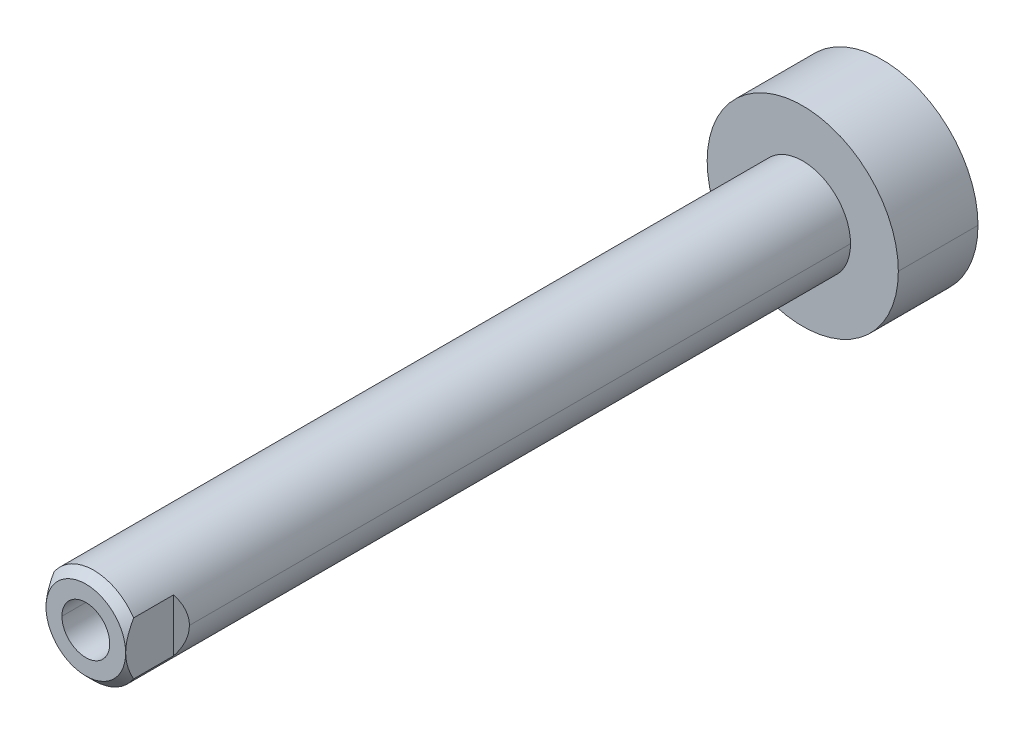
ISO-10303-21;
HEADER;
FILE_DESCRIPTION(('STEP AP214'),'2;1');
FILE_NAME('part.step','',(''),(''),'','','');
FILE_SCHEMA(('AUTOMOTIVE_DESIGN { 1 0 10303 214 1 1 1 1 }'));
ENDSEC;
DATA;
#1=APPLICATION_CONTEXT('core data for automotive mechanical design processes');
#2=APPLICATION_PROTOCOL_DEFINITION('international standard','automotive_design',2000,#1);
#3=PRODUCT_CONTEXT('',#1,'mechanical');
#4=PRODUCT('Part','Part','',(#3));
#5=PRODUCT_RELATED_PRODUCT_CATEGORY('part','',(#4));
#6=PRODUCT_DEFINITION_FORMATION('','',#4);
#7=PRODUCT_DEFINITION_CONTEXT('part definition',#1,'design');
#8=PRODUCT_DEFINITION('design','',#6,#7);
#9=PRODUCT_DEFINITION_SHAPE('','',#8);
#10=(LENGTH_UNIT() NAMED_UNIT(*) SI_UNIT(.MILLI.,.METRE.));
#11=(NAMED_UNIT(*) PLANE_ANGLE_UNIT() SI_UNIT($,.RADIAN.));
#12=(NAMED_UNIT(*) SI_UNIT($,.STERADIAN.) SOLID_ANGLE_UNIT());
#13=UNCERTAINTY_MEASURE_WITH_UNIT(LENGTH_MEASURE(1.E-05),#10,'distance_accuracy_value','');
#14=(GEOMETRIC_REPRESENTATION_CONTEXT(3) GLOBAL_UNCERTAINTY_ASSIGNED_CONTEXT((#13)) GLOBAL_UNIT_ASSIGNED_CONTEXT((#10,
#11,#12)) REPRESENTATION_CONTEXT('',''));
#15=CARTESIAN_POINT('',(0.,0.,0.));
#16=DIRECTION('',(0.,0.,1.));
#17=DIRECTION('',(1.,0.,0.));
#18=AXIS2_PLACEMENT_3D('',#15,#16,#17);
#19=CARTESIAN_POINT('',(0.,0.,32.5));
#20=DIRECTION('',(0.,0.,1.));
#21=DIRECTION('',(1.,0.,0.));
#22=AXIS2_PLACEMENT_3D('',#19,#20,#21);
#23=CYLINDRICAL_SURFACE('',#22,1.5);
#24=CARTESIAN_POINT('',(0.,0.,26.5));
#25=DIRECTION('',(0.,0.,1.));
#26=DIRECTION('',(1.,0.,0.));
#27=AXIS2_PLACEMENT_3D('',#24,#25,#26);
#28=CIRCLE('',#27,1.5);
#29=CARTESIAN_POINT('',(-1.5,0.,26.5));
#30=VERTEX_POINT('',#29);
#31=CARTESIAN_POINT('',(1.5,0.,26.5));
#32=VERTEX_POINT('',#31);
#33=EDGE_CURVE('E41',#30,#32,#28,.T.);
#34=ORIENTED_EDGE('',*,*,#33,.F.);
#35=DIRECTION('',(0.,0.,1.));
#36=VECTOR('',#35,1.);
#37=CARTESIAN_POINT('',(-1.5,0.,32.5));
#38=LINE('',#37,#36);
#39=CARTESIAN_POINT('',(-1.5,0.,32.5));
#40=VERTEX_POINT('',#39);
#41=EDGE_CURVE('E11',#30,#40,#38,.T.);
#42=ORIENTED_EDGE('',*,*,#41,.T.);
#43=CARTESIAN_POINT('',(0.,0.,32.5));
#44=DIRECTION('',(0.,0.,1.));
#45=DIRECTION('',(1.,0.,0.));
#46=AXIS2_PLACEMENT_3D('',#43,#44,#45);
#47=CIRCLE('',#46,1.5);
#48=CARTESIAN_POINT('',(1.5,0.,32.5));
#49=VERTEX_POINT('',#48);
#50=EDGE_CURVE('E27',#40,#49,#47,.T.);
#51=ORIENTED_EDGE('',*,*,#50,.T.);
#52=DIRECTION('',(0.,0.,1.));
#53=VECTOR('',#52,1.);
#54=CARTESIAN_POINT('',(1.5,0.,32.5));
#55=LINE('',#54,#53);
#56=EDGE_CURVE('E295',#32,#49,#55,.T.);
#57=ORIENTED_EDGE('',*,*,#56,.F.);
#58=EDGE_LOOP('',(#34,#42,#51,#57));
#59=FACE_BOUND('',#58,.T.);
#60=ADVANCED_FACE('F16',(#59),#23,.F.);
#61=CARTESIAN_POINT('',(0.,0.,32.5));
#62=DIRECTION('',(0.,0.,1.));
#63=DIRECTION('',(1.,0.,0.));
#64=AXIS2_PLACEMENT_3D('',#61,#62,#63);
#65=CYLINDRICAL_SURFACE('',#64,1.25);
#66=CARTESIAN_POINT('',(0.,0.,25.));
#67=DIRECTION('',(0.,0.,1.));
#68=DIRECTION('',(1.,0.,0.));
#69=AXIS2_PLACEMENT_3D('',#66,#67,#68);
#70=CIRCLE('',#69,1.25);
#71=CARTESIAN_POINT('',(-1.25,0.,25.));
#72=VERTEX_POINT('',#71);
#73=CARTESIAN_POINT('',(1.25,0.,25.));
#74=VERTEX_POINT('',#73);
#75=EDGE_CURVE('E250',#72,#74,#70,.T.);
#76=ORIENTED_EDGE('',*,*,#75,.F.);
#77=DIRECTION('',(0.,0.,1.));
#78=VECTOR('',#77,1.);
#79=CARTESIAN_POINT('',(-1.25,0.,32.5));
#80=LINE('',#79,#78);
#81=CARTESIAN_POINT('',(-1.25,0.,26.5));
#82=VERTEX_POINT('',#81);
#83=EDGE_CURVE('E425',#72,#82,#80,.T.);
#84=ORIENTED_EDGE('',*,*,#83,.T.);
#85=CARTESIAN_POINT('',(0.,0.,26.5));
#86=DIRECTION('',(0.,0.,1.));
#87=DIRECTION('',(1.,0.,0.));
#88=AXIS2_PLACEMENT_3D('',#85,#86,#87);
#89=CIRCLE('',#88,1.25);
#90=CARTESIAN_POINT('',(1.25,0.,26.5));
#91=VERTEX_POINT('',#90);
#92=EDGE_CURVE('E270',#82,#91,#89,.T.);
#93=ORIENTED_EDGE('',*,*,#92,.T.);
#94=DIRECTION('',(0.,0.,1.));
#95=VECTOR('',#94,1.);
#96=CARTESIAN_POINT('',(1.25,0.,32.5));
#97=LINE('',#96,#95);
#98=EDGE_CURVE('E240',#74,#91,#97,.T.);
#99=ORIENTED_EDGE('',*,*,#98,.F.);
#100=EDGE_LOOP('',(#76,#84,#93,#99));
#101=FACE_BOUND('',#100,.T.);
#102=ADVANCED_FACE('F411',(#101),#65,.F.);
#103=CARTESIAN_POINT('',(0.,0.,25.));
#104=DIRECTION('',(0.,0.,1.));
#105=DIRECTION('',(1.,0.,0.));
#106=AXIS2_PLACEMENT_3D('',#103,#104,#105);
#107=CONICAL_SURFACE('',#106,1.25,1.02974425867665);
#108=DIRECTION('',(0.857167300702112,0.,0.515038074910055));
#109=VECTOR('',#108,1.);
#110=CARTESIAN_POINT('',(1.25,0.,25.));
#111=LINE('',#110,#109);
#112=CARTESIAN_POINT('',(0.,0.,24.2489242262155));
#113=VERTEX_POINT('',#112);
#114=EDGE_CURVE('E242',#113,#74,#111,.T.);
#115=ORIENTED_EDGE('',*,*,#114,.F.);
#116=DIRECTION('',(-0.857167300702112,0.,0.515038074910055));
#117=VECTOR('',#116,1.);
#118=CARTESIAN_POINT('',(-1.25,0.,25.));
#119=LINE('',#118,#117);
#120=EDGE_CURVE('E266',#113,#72,#119,.T.);
#121=ORIENTED_EDGE('',*,*,#120,.T.);
#122=ORIENTED_EDGE('',*,*,#75,.T.);
#123=EDGE_LOOP('',(#115,#121,#122));
#124=FACE_BOUND('',#123,.T.);
#125=ADVANCED_FACE('F366',(#124),#107,.F.);
#126=CARTESIAN_POINT('',(0.,0.,-17.5));
#127=DIRECTION('',(0.,0.,1.));
#128=DIRECTION('',(1.,0.,0.));
#129=AXIS2_PLACEMENT_3D('',#126,#127,#128);
#130=CYLINDRICAL_SURFACE('',#129,3.);
#131=CARTESIAN_POINT('',(0.,0.,-12.5));
#132=DIRECTION('',(0.,0.,1.));
#133=DIRECTION('',(1.,0.,0.));
#134=AXIS2_PLACEMENT_3D('',#131,#132,#133);
#135=CIRCLE('',#134,3.);
#136=CARTESIAN_POINT('',(3.,0.,-12.5));
#137=VERTEX_POINT('',#136);
#138=CARTESIAN_POINT('',(-3.,0.,-12.5));
#139=VERTEX_POINT('',#138);
#140=EDGE_CURVE('E222',#137,#139,#135,.T.);
#141=ORIENTED_EDGE('',*,*,#140,.T.);
#142=DIRECTION('',(0.,0.,1.));
#143=VECTOR('',#142,1.);
#144=CARTESIAN_POINT('',(-3.,0.,-17.5));
#145=LINE('',#144,#143);
#146=CARTESIAN_POINT('',(-3.,0.,29.));
#147=VERTEX_POINT('',#146);
#148=EDGE_CURVE('E213',#139,#147,#145,.T.);
#149=ORIENTED_EDGE('',*,*,#148,.T.);
#150=CARTESIAN_POINT('',(-3.,0.,29.));
#151=CARTESIAN_POINT('',(-3.,0.594215243544948,29.));
#152=CARTESIAN_POINT('',(-2.82846483459138,1.16313302555691,29.1715351654086));
#153=CARTESIAN_POINT('',(-2.5,1.65831239517771,29.5));
#154=(BOUNDED_CURVE() B_SPLINE_CURVE(3,(#150,#151,#152,#153),.UNSPECIFIED.,.F.,
.F.) B_SPLINE_CURVE_WITH_KNOTS((4,4),(3.1415926535898,3.72727819704694),
.UNSPECIFIED.) CURVE() GEOMETRIC_REPRESENTATION_ITEM() RATIONAL_B_SPLINE_CURVE((1.,
0.971618071837558,0.971618071837558,1.)) REPRESENTATION_ITEM(''));
#155=CARTESIAN_POINT('',(-2.5,1.65831239517771,29.5));
#156=VERTEX_POINT('',#155);
#157=EDGE_CURVE('E206',#147,#156,#154,.T.);
#158=ORIENTED_EDGE('',*,*,#157,.T.);
#159=DIRECTION('',(0.,0.,1.));
#160=VECTOR('',#159,1.);
#161=CARTESIAN_POINT('',(-2.5,1.65831239517771,29.5));
#162=LINE('',#161,#160);
#163=CARTESIAN_POINT('',(-2.5,1.65831239517771,32.));
#164=VERTEX_POINT('',#163);
#165=EDGE_CURVE('E155',#156,#164,#162,.T.);
#166=ORIENTED_EDGE('',*,*,#165,.T.);
#167=CARTESIAN_POINT('',(0.,0.,32.));
#168=DIRECTION('',(0.,0.,-1.));
#169=DIRECTION('',(-1.,0.,0.));
#170=AXIS2_PLACEMENT_3D('',#167,#168,#169);
#171=CIRCLE('',#170,3.);
#172=CARTESIAN_POINT('',(2.5,1.65831239517771,32.));
#173=VERTEX_POINT('',#172);
#174=EDGE_CURVE('E151',#164,#173,#171,.T.);
#175=ORIENTED_EDGE('',*,*,#174,.T.);
#176=DIRECTION('',(0.,0.,1.));
#177=VECTOR('',#176,1.);
#178=CARTESIAN_POINT('',(2.5,1.65831239517771,29.5));
#179=LINE('',#178,#177);
#180=CARTESIAN_POINT('',(2.5,1.65831239517771,29.5));
#181=VERTEX_POINT('',#180);
#182=EDGE_CURVE('E134',#181,#173,#179,.T.);
#183=ORIENTED_EDGE('',*,*,#182,.F.);
#184=CARTESIAN_POINT('',(2.5,1.65831239517771,29.5));
#185=CARTESIAN_POINT('',(2.82846483459137,1.16313302555691,29.1715351654086));
#186=CARTESIAN_POINT('',(3.,0.594215243544947,29.));
#187=CARTESIAN_POINT('',(3.,0.,29.));
#188=(BOUNDED_CURVE() B_SPLINE_CURVE(3,(#184,#185,#186,#187),.UNSPECIFIED.,.F.,
.F.) B_SPLINE_CURVE_WITH_KNOTS((4,4),(2.55590711013264,3.1415926535898),
.UNSPECIFIED.) CURVE() GEOMETRIC_REPRESENTATION_ITEM() RATIONAL_B_SPLINE_CURVE((1.,
0.971618071837559,0.971618071837559,1.)) REPRESENTATION_ITEM(''));
#189=CARTESIAN_POINT('',(3.,0.,29.));
#190=VERTEX_POINT('',#189);
#191=EDGE_CURVE('E160',#181,#190,#188,.T.);
#192=ORIENTED_EDGE('',*,*,#191,.T.);
#193=DIRECTION('',(0.,0.,1.));
#194=VECTOR('',#193,1.);
#195=CARTESIAN_POINT('',(3.,0.,-17.5));
#196=LINE('',#195,#194);
#197=EDGE_CURVE('E279',#137,#190,#196,.T.);
#198=ORIENTED_EDGE('',*,*,#197,.F.);
#199=EDGE_LOOP('',(#141,#149,#158,#166,#175,#183,#192,#198));
#200=FACE_BOUND('',#199,.T.);
#201=ADVANCED_FACE('F153',(#200),#130,.T.);
#202=CARTESIAN_POINT('',(0.,0.,-17.5));
#203=DIRECTION('',(0.,0.,1.));
#204=DIRECTION('',(1.,0.,0.));
#205=AXIS2_PLACEMENT_3D('',#202,#203,#204);
#206=CYLINDRICAL_SURFACE('',#205,6.);
#207=CARTESIAN_POINT('',(0.,0.,-17.5));
#208=DIRECTION('',(0.,0.,1.));
#209=DIRECTION('',(1.,0.,0.));
#210=AXIS2_PLACEMENT_3D('',#207,#208,#209);
#211=CIRCLE('',#210,6.);
#212=CARTESIAN_POINT('',(6.,0.,-17.5));
#213=VERTEX_POINT('',#212);
#214=CARTESIAN_POINT('',(-6.,0.,-17.5));
#215=VERTEX_POINT('',#214);
#216=EDGE_CURVE('E287',#213,#215,#211,.T.);
#217=ORIENTED_EDGE('',*,*,#216,.T.);
#218=DIRECTION('',(0.,0.,1.));
#219=VECTOR('',#218,1.);
#220=CARTESIAN_POINT('',(-6.,0.,-17.5));
#221=LINE('',#220,#219);
#222=CARTESIAN_POINT('',(-6.,0.,-12.5));
#223=VERTEX_POINT('',#222);
#224=EDGE_CURVE('E300',#215,#223,#221,.T.);
#225=ORIENTED_EDGE('',*,*,#224,.T.);
#226=CARTESIAN_POINT('',(0.,0.,-12.5));
#227=DIRECTION('',(0.,0.,1.));
#228=DIRECTION('',(1.,0.,0.));
#229=AXIS2_PLACEMENT_3D('',#226,#227,#228);
#230=CIRCLE('',#229,6.);
#231=CARTESIAN_POINT('',(6.,0.,-12.5));
#232=VERTEX_POINT('',#231);
#233=EDGE_CURVE('E233',#232,#223,#230,.T.);
#234=ORIENTED_EDGE('',*,*,#233,.F.);
#235=DIRECTION('',(0.,0.,1.));
#236=VECTOR('',#235,1.);
#237=CARTESIAN_POINT('',(6.,0.,-17.5));
#238=LINE('',#237,#236);
#239=EDGE_CURVE('E265',#213,#232,#238,.T.);
#240=ORIENTED_EDGE('',*,*,#239,.F.);
#241=EDGE_LOOP('',(#217,#225,#234,#240));
#242=FACE_BOUND('',#241,.T.);
#243=ADVANCED_FACE('F398',(#242),#206,.T.);
#244=CARTESIAN_POINT('',(0.,0.,-17.5));
#245=DIRECTION('',(0.,0.,1.));
#246=DIRECTION('',(1.,0.,0.));
#247=AXIS2_PLACEMENT_3D('',#244,#245,#246);
#248=PLANE('',#247);
#249=ORIENTED_EDGE('',*,*,#216,.F.);
#250=CARTESIAN_POINT('',(0.,0.,-17.5));
#251=DIRECTION('',(0.,0.,1.));
#252=DIRECTION('',(1.,0.,0.));
#253=AXIS2_PLACEMENT_3D('',#250,#251,#252);
#254=CIRCLE('',#253,6.);
#255=EDGE_CURVE('E301',#215,#213,#254,.T.);
#256=ORIENTED_EDGE('',*,*,#255,.F.);
#257=EDGE_LOOP('',(#249,#256));
#258=FACE_BOUND('',#257,.T.);
#259=ADVANCED_FACE('F402',(#258),#248,.F.);
#260=CARTESIAN_POINT('',(0.,0.,-17.5));
#261=DIRECTION('',(0.,0.,1.));
#262=DIRECTION('',(1.,0.,0.));
#263=AXIS2_PLACEMENT_3D('',#260,#261,#262);
#264=CYLINDRICAL_SURFACE('',#263,6.);
#265=ORIENTED_EDGE('',*,*,#224,.F.);
#266=ORIENTED_EDGE('',*,*,#255,.T.);
#267=ORIENTED_EDGE('',*,*,#239,.T.);
#268=CARTESIAN_POINT('',(0.,0.,-12.5));
#269=DIRECTION('',(0.,0.,1.));
#270=DIRECTION('',(1.,0.,0.));
#271=AXIS2_PLACEMENT_3D('',#268,#269,#270);
#272=CIRCLE('',#271,6.);
#273=EDGE_CURVE('E228',#223,#232,#272,.T.);
#274=ORIENTED_EDGE('',*,*,#273,.F.);
#275=EDGE_LOOP('',(#265,#266,#267,#274));
#276=FACE_BOUND('',#275,.T.);
#277=ADVANCED_FACE('F18',(#276),#264,.T.);
#278=CARTESIAN_POINT('',(0.,6.,-12.5));
#279=DIRECTION('',(0.,0.,-1.));
#280=DIRECTION('',(0.,-1.,0.));
#281=AXIS2_PLACEMENT_3D('',#278,#279,#280);
#282=PLANE('',#281);
#283=ORIENTED_EDGE('',*,*,#233,.T.);
#284=ORIENTED_EDGE('',*,*,#273,.T.);
#285=EDGE_LOOP('',(#283,#284));
#286=FACE_BOUND('',#285,.T.);
#287=ORIENTED_EDGE('',*,*,#140,.F.);
#288=CARTESIAN_POINT('',(0.,0.,-12.5));
#289=DIRECTION('',(0.,0.,1.));
#290=DIRECTION('',(1.,0.,0.));
#291=AXIS2_PLACEMENT_3D('',#288,#289,#290);
#292=CIRCLE('',#291,3.);
#293=EDGE_CURVE('E234',#139,#137,#292,.T.);
#294=ORIENTED_EDGE('',*,*,#293,.F.);
#295=EDGE_LOOP('',(#287,#294));
#296=FACE_BOUND('',#295,.T.);
#297=ADVANCED_FACE('F476',(#286,#296),#282,.F.);
#298=CARTESIAN_POINT('',(0.,0.,-17.5));
#299=DIRECTION('',(0.,0.,1.));
#300=DIRECTION('',(1.,0.,0.));
#301=AXIS2_PLACEMENT_3D('',#298,#299,#300);
#302=CYLINDRICAL_SURFACE('',#301,3.);
#303=ORIENTED_EDGE('',*,*,#148,.F.);
#304=ORIENTED_EDGE('',*,*,#293,.T.);
#305=ORIENTED_EDGE('',*,*,#197,.T.);
#306=CARTESIAN_POINT('',(3.,0.,29.));
#307=CARTESIAN_POINT('',(3.,-0.594215243544945,29.));
#308=CARTESIAN_POINT('',(2.82846483459137,-1.16313302555691,29.1715351654086));
#309=CARTESIAN_POINT('',(2.5,-1.65831239517771,29.5));
#310=(BOUNDED_CURVE() B_SPLINE_CURVE(3,(#306,#307,#308,#309),.UNSPECIFIED.,.F.,
.F.) B_SPLINE_CURVE_WITH_KNOTS((4,4),(3.1415926535898,3.72727819704694),
.UNSPECIFIED.) CURVE() GEOMETRIC_REPRESENTATION_ITEM() RATIONAL_B_SPLINE_CURVE((1.,
0.971618071837559,0.971618071837559,1.)) REPRESENTATION_ITEM(''));
#311=CARTESIAN_POINT('',(2.5,-1.65831239517771,29.5));
#312=VERTEX_POINT('',#311);
#313=EDGE_CURVE('E274',#190,#312,#310,.T.);
#314=ORIENTED_EDGE('',*,*,#313,.T.);
#315=DIRECTION('',(0.,0.,1.));
#316=VECTOR('',#315,1.);
#317=CARTESIAN_POINT('',(2.5,-1.65831239517771,29.5));
#318=LINE('',#317,#316);
#319=CARTESIAN_POINT('',(2.5,-1.65831239517771,32.));
#320=VERTEX_POINT('',#319);
#321=EDGE_CURVE('E117',#312,#320,#318,.T.);
#322=ORIENTED_EDGE('',*,*,#321,.T.);
#323=CARTESIAN_POINT('',(0.,0.,32.));
#324=DIRECTION('',(0.,0.,-1.));
#325=DIRECTION('',(-1.,0.,0.));
#326=AXIS2_PLACEMENT_3D('',#323,#324,#325);
#327=CIRCLE('',#326,3.);
#328=CARTESIAN_POINT('',(-2.5,-1.65831239517771,32.));
#329=VERTEX_POINT('',#328);
#330=EDGE_CURVE('E104',#320,#329,#327,.T.);
#331=ORIENTED_EDGE('',*,*,#330,.T.);
#332=DIRECTION('',(0.,0.,1.));
#333=VECTOR('',#332,1.);
#334=CARTESIAN_POINT('',(-2.5,-1.65831239517771,29.5));
#335=LINE('',#334,#333);
#336=CARTESIAN_POINT('',(-2.5,-1.65831239517771,29.5));
#337=VERTEX_POINT('',#336);
#338=EDGE_CURVE('E296',#337,#329,#335,.T.);
#339=ORIENTED_EDGE('',*,*,#338,.F.);
#340=CARTESIAN_POINT('',(-2.5,-1.65831239517771,29.5));
#341=CARTESIAN_POINT('',(-2.82846483459138,-1.16313302555691,29.1715351654086));
#342=CARTESIAN_POINT('',(-3.,-0.594215243544948,29.));
#343=CARTESIAN_POINT('',(-3.,0.,29.));
#344=(BOUNDED_CURVE() B_SPLINE_CURVE(3,(#340,#341,#342,#343),.UNSPECIFIED.,.F.,
.F.) B_SPLINE_CURVE_WITH_KNOTS((4,4),(2.55590711013264,3.1415926535898),
.UNSPECIFIED.) CURVE() GEOMETRIC_REPRESENTATION_ITEM() RATIONAL_B_SPLINE_CURVE((1.,
0.971618071837558,0.971618071837558,1.)) REPRESENTATION_ITEM(''));
#345=EDGE_CURVE('E251',#337,#147,#344,.T.);
#346=ORIENTED_EDGE('',*,*,#345,.T.);
#347=EDGE_LOOP('',(#303,#304,#305,#314,#322,#331,#339,#346));
#348=FACE_BOUND('',#347,.T.);
#349=ADVANCED_FACE('F383',(#348),#302,.T.);
#350=CARTESIAN_POINT('',(0.,3.,32.5));
#351=DIRECTION('',(0.,0.,-1.));
#352=DIRECTION('',(0.,-1.,0.));
#353=AXIS2_PLACEMENT_3D('',#350,#351,#352);
#354=PLANE('',#353);
#355=CARTESIAN_POINT('',(0.,0.,32.5));
#356=DIRECTION('',(0.,0.,1.));
#357=DIRECTION('',(-1.,0.,0.));
#358=AXIS2_PLACEMENT_3D('',#355,#356,#357);
#359=CIRCLE('',#358,2.5);
#360=CARTESIAN_POINT('',(2.5,0.,32.5));
#361=VERTEX_POINT('',#360);
#362=CARTESIAN_POINT('',(-2.5,0.,32.5));
#363=VERTEX_POINT('',#362);
#364=EDGE_CURVE('E166',#361,#363,#359,.T.);
#365=ORIENTED_EDGE('',*,*,#364,.T.);
#366=CARTESIAN_POINT('',(0.,0.,32.5));
#367=DIRECTION('',(0.,0.,1.));
#368=DIRECTION('',(-1.,0.,0.));
#369=AXIS2_PLACEMENT_3D('',#366,#367,#368);
#370=CIRCLE('',#369,2.5);
#371=EDGE_CURVE('E246',#363,#361,#370,.T.);
#372=ORIENTED_EDGE('',*,*,#371,.T.);
#373=EDGE_LOOP('',(#365,#372));
#374=FACE_BOUND('',#373,.T.);
#375=CARTESIAN_POINT('',(0.,0.,32.5));
#376=DIRECTION('',(0.,0.,1.));
#377=DIRECTION('',(1.,0.,0.));
#378=AXIS2_PLACEMENT_3D('',#375,#376,#377);
#379=CIRCLE('',#378,1.5);
#380=EDGE_CURVE('E288',#49,#40,#379,.T.);
#381=ORIENTED_EDGE('',*,*,#380,.F.);
#382=ORIENTED_EDGE('',*,*,#50,.F.);
#383=EDGE_LOOP('',(#381,#382));
#384=FACE_BOUND('',#383,.T.);
#385=ADVANCED_FACE('F409',(#374,#384),#354,.F.);
#386=CARTESIAN_POINT('',(0.,0.,25.));
#387=DIRECTION('',(0.,0.,1.));
#388=DIRECTION('',(1.,0.,0.));
#389=AXIS2_PLACEMENT_3D('',#386,#387,#388);
#390=CONICAL_SURFACE('',#389,1.25,1.02974425867665);
#391=ORIENTED_EDGE('',*,*,#120,.F.);
#392=ORIENTED_EDGE('',*,*,#114,.T.);
#393=CARTESIAN_POINT('',(0.,0.,25.));
#394=DIRECTION('',(0.,0.,1.));
#395=DIRECTION('',(1.,0.,0.));
#396=AXIS2_PLACEMENT_3D('',#393,#394,#395);
#397=CIRCLE('',#396,1.25);
#398=EDGE_CURVE('E247',#74,#72,#397,.T.);
#399=ORIENTED_EDGE('',*,*,#398,.T.);
#400=EDGE_LOOP('',(#391,#392,#399));
#401=FACE_BOUND('',#400,.T.);
#402=ADVANCED_FACE('F407',(#401),#390,.F.);
#403=CARTESIAN_POINT('',(0.,0.,32.5));
#404=DIRECTION('',(0.,0.,1.));
#405=DIRECTION('',(1.,0.,0.));
#406=AXIS2_PLACEMENT_3D('',#403,#404,#405);
#407=CYLINDRICAL_SURFACE('',#406,1.25);
#408=ORIENTED_EDGE('',*,*,#83,.F.);
#409=ORIENTED_EDGE('',*,*,#398,.F.);
#410=ORIENTED_EDGE('',*,*,#98,.T.);
#411=CARTESIAN_POINT('',(0.,0.,26.5));
#412=DIRECTION('',(0.,0.,1.));
#413=DIRECTION('',(1.,0.,0.));
#414=AXIS2_PLACEMENT_3D('',#411,#412,#413);
#415=CIRCLE('',#414,1.25);
#416=EDGE_CURVE('E236',#91,#82,#415,.T.);
#417=ORIENTED_EDGE('',*,*,#416,.T.);
#418=EDGE_LOOP('',(#408,#409,#410,#417));
#419=FACE_BOUND('',#418,.T.);
#420=ADVANCED_FACE('F189',(#419),#407,.F.);
#421=CARTESIAN_POINT('',(1.25,0.,26.5));
#422=DIRECTION('',(0.,0.,-1.));
#423=DIRECTION('',(0.,-1.,0.));
#424=AXIS2_PLACEMENT_3D('',#421,#422,#423);
#425=PLANE('',#424);
#426=CARTESIAN_POINT('',(0.,0.,26.5));
#427=DIRECTION('',(0.,0.,1.));
#428=DIRECTION('',(1.,0.,0.));
#429=AXIS2_PLACEMENT_3D('',#426,#427,#428);
#430=CIRCLE('',#429,1.5);
#431=EDGE_CURVE('E241',#32,#30,#430,.T.);
#432=ORIENTED_EDGE('',*,*,#431,.T.);
#433=ORIENTED_EDGE('',*,*,#33,.T.);
#434=EDGE_LOOP('',(#432,#433));
#435=FACE_BOUND('',#434,.T.);
#436=ORIENTED_EDGE('',*,*,#416,.F.);
#437=ORIENTED_EDGE('',*,*,#92,.F.);
#438=EDGE_LOOP('',(#436,#437));
#439=FACE_BOUND('',#438,.T.);
#440=ADVANCED_FACE('F468',(#435,#439),#425,.F.);
#441=CARTESIAN_POINT('',(0.,0.,32.5));
#442=DIRECTION('',(0.,0.,1.));
#443=DIRECTION('',(1.,0.,0.));
#444=AXIS2_PLACEMENT_3D('',#441,#442,#443);
#445=CYLINDRICAL_SURFACE('',#444,1.5);
#446=ORIENTED_EDGE('',*,*,#41,.F.);
#447=ORIENTED_EDGE('',*,*,#431,.F.);
#448=ORIENTED_EDGE('',*,*,#56,.T.);
#449=ORIENTED_EDGE('',*,*,#380,.T.);
#450=EDGE_LOOP('',(#446,#447,#448,#449));
#451=FACE_BOUND('',#450,.T.);
#452=ADVANCED_FACE('F324',(#451),#445,.F.);
#453=CARTESIAN_POINT('',(-2.5,1.65831239517771,29.5));
#454=DIRECTION('',(1.,0.,0.));
#455=DIRECTION('',(0.,1.,0.));
#456=AXIS2_PLACEMENT_3D('',#453,#454,#455);
#457=PLANE('',#456);
#458=ORIENTED_EDGE('',*,*,#338,.T.);
#459=CARTESIAN_POINT('',(-2.5,-1.65831239517771,32.));
#460=CARTESIAN_POINT('',(-2.5,-1.23591829372473,32.2334871246964));
#461=CARTESIAN_POINT('',(-2.5,-0.863018125454165,32.355231525282));
#462=CARTESIAN_POINT('',(-2.5,-0.419595772368565,32.5));
#463=CARTESIAN_POINT('',(-2.5,0.,32.5));
#464=B_SPLINE_CURVE_WITH_KNOTS('',2,(#459,#460,#461,#462,#463),.UNSPECIFIED.,.F.,.F.,(3,2,3),
(0.,0.5,1.),.UNSPECIFIED.);
#465=EDGE_CURVE('E307',#329,#363,#464,.T.);
#466=ORIENTED_EDGE('',*,*,#465,.T.);
#467=CARTESIAN_POINT('',(-2.5,0.,32.5));
#468=CARTESIAN_POINT('',(-2.5,0.416919342283575,32.5));
#469=CARTESIAN_POINT('',(-2.5,0.858219322807868,32.3567935370008));
#470=CARTESIAN_POINT('',(-2.5,1.23268013725167,32.2352770830354));
#471=CARTESIAN_POINT('',(-2.5,1.65831239517771,32.));
#472=B_SPLINE_CURVE_WITH_KNOTS('',2,(#467,#468,#469,#470,#471),.UNSPECIFIED.,.F.,.F.,(3,2,3),
(0.,0.5,1.),.UNSPECIFIED.);
#473=EDGE_CURVE('E168',#363,#164,#472,.T.);
#474=ORIENTED_EDGE('',*,*,#473,.T.);
#475=ORIENTED_EDGE('',*,*,#165,.F.);
#476=DIRECTION('',(0.,1.,0.));
#477=VECTOR('',#476,1.);
#478=CARTESIAN_POINT('',(-2.5,1.65831239517771,29.5));
#479=LINE('',#478,#477);
#480=EDGE_CURVE('E148',#337,#156,#479,.T.);
#481=ORIENTED_EDGE('',*,*,#480,.F.);
#482=EDGE_LOOP('',(#458,#466,#474,#475,#481));
#483=FACE_BOUND('',#482,.T.);
#484=ADVANCED_FACE('F314',(#483),#457,.F.);
#485=CARTESIAN_POINT('',(2.5,1.65831239517771,29.5));
#486=DIRECTION('',(-1.,0.,0.));
#487=DIRECTION('',(0.,0.,1.));
#488=AXIS2_PLACEMENT_3D('',#485,#486,#487);
#489=PLANE('',#488);
#490=CARTESIAN_POINT('',(2.5,1.65831239517771,32.));
#491=CARTESIAN_POINT('',(2.5,1.23591829372473,32.2334871246964));
#492=CARTESIAN_POINT('',(2.5,0.863018125454168,32.355231525282));
#493=CARTESIAN_POINT('',(2.5,0.419595772368569,32.5));
#494=CARTESIAN_POINT('',(2.5,0.,32.5));
#495=B_SPLINE_CURVE_WITH_KNOTS('',2,(#490,#491,#492,#493,#494),.UNSPECIFIED.,.F.,.F.,(3,2,3),
(0.,0.5,1.),.UNSPECIFIED.);
#496=EDGE_CURVE('E138',#173,#361,#495,.T.);
#497=ORIENTED_EDGE('',*,*,#496,.T.);
#498=CARTESIAN_POINT('',(2.5,0.,32.5));
#499=CARTESIAN_POINT('',(2.5,-0.416919342283485,32.5));
#500=CARTESIAN_POINT('',(2.5,-0.858219322807865,32.3567935370008));
#501=CARTESIAN_POINT('',(2.5,-1.23268013725155,32.2352770830355));
#502=CARTESIAN_POINT('',(2.5,-1.65831239517771,32.));
#503=B_SPLINE_CURVE_WITH_KNOTS('',2,(#498,#499,#500,#501,#502),.UNSPECIFIED.,.F.,.F.,(3,2,3),
(0.,0.5,1.),.UNSPECIFIED.);
#504=EDGE_CURVE('E147',#361,#320,#503,.T.);
#505=ORIENTED_EDGE('',*,*,#504,.T.);
#506=ORIENTED_EDGE('',*,*,#321,.F.);
#507=DIRECTION('',(0.,-1.,0.));
#508=VECTOR('',#507,1.);
#509=CARTESIAN_POINT('',(2.5,1.65831239517771,29.5));
#510=LINE('',#509,#508);
#511=EDGE_CURVE('E142',#181,#312,#510,.T.);
#512=ORIENTED_EDGE('',*,*,#511,.F.);
#513=ORIENTED_EDGE('',*,*,#182,.T.);
#514=EDGE_LOOP('',(#497,#505,#506,#512,#513));
#515=FACE_BOUND('',#514,.T.);
#516=ADVANCED_FACE('F136',(#515),#489,.F.);
#517=CARTESIAN_POINT('',(-2.5,-6.,29.5));
#518=DIRECTION('',(0.707106781186545,0.,-0.70710678118655));
#519=DIRECTION('',(0.,-1.,0.));
#520=AXIS2_PLACEMENT_3D('',#517,#518,#519);
#521=PLANE('',#520);
#522=ORIENTED_EDGE('',*,*,#480,.T.);
#523=ORIENTED_EDGE('',*,*,#157,.F.);
#524=ORIENTED_EDGE('',*,*,#345,.F.);
#525=EDGE_LOOP('',(#522,#523,#524));
#526=FACE_BOUND('',#525,.T.);
#527=ADVANCED_FACE('F326',(#526),#521,.F.);
#528=CARTESIAN_POINT('',(2.5,-6.,29.5));
#529=DIRECTION('',(-0.707106781186545,0.,-0.70710678118655));
#530=DIRECTION('',(-0.70710678118655,0.,0.707106781186545));
#531=AXIS2_PLACEMENT_3D('',#528,#529,#530);
#532=PLANE('',#531);
#533=ORIENTED_EDGE('',*,*,#511,.T.);
#534=ORIENTED_EDGE('',*,*,#313,.F.);
#535=ORIENTED_EDGE('',*,*,#191,.F.);
#536=EDGE_LOOP('',(#533,#534,#535));
#537=FACE_BOUND('',#536,.T.);
#538=ADVANCED_FACE('F187',(#537),#532,.F.);
#539=CARTESIAN_POINT('',(0.,0.,32.5));
#540=DIRECTION('',(0.,0.,-1.));
#541=DIRECTION('',(-1.,0.,0.));
#542=AXIS2_PLACEMENT_3D('',#539,#540,#541);
#543=CONICAL_SURFACE('',#542,2.5,0.785398163397446);
#544=ORIENTED_EDGE('',*,*,#465,.F.);
#545=ORIENTED_EDGE('',*,*,#330,.F.);
#546=ORIENTED_EDGE('',*,*,#504,.F.);
#547=ORIENTED_EDGE('',*,*,#371,.F.);
#548=EDGE_LOOP('',(#544,#545,#546,#547));
#549=FACE_BOUND('',#548,.T.);
#550=ADVANCED_FACE('F186',(#549),#543,.T.);
#551=CARTESIAN_POINT('',(0.,0.,32.5));
#552=DIRECTION('',(0.,0.,-1.));
#553=DIRECTION('',(-1.,0.,0.));
#554=AXIS2_PLACEMENT_3D('',#551,#552,#553);
#555=CONICAL_SURFACE('',#554,2.5,0.785398163397446);
#556=ORIENTED_EDGE('',*,*,#496,.F.);
#557=ORIENTED_EDGE('',*,*,#174,.F.);
#558=ORIENTED_EDGE('',*,*,#473,.F.);
#559=ORIENTED_EDGE('',*,*,#364,.F.);
#560=EDGE_LOOP('',(#556,#557,#558,#559));
#561=FACE_BOUND('',#560,.T.);
#562=ADVANCED_FACE('F164',(#561),#555,.T.);
#563=CLOSED_SHELL('',(#60,#102,#125,#201,#243,#259,#277,#297,#349,#385,#402,#420,#440,#452,#484,
#516,#527,#538,#550,#562));
#564=MANIFOLD_SOLID_BREP('B1',#563);
#565=ADVANCED_BREP_SHAPE_REPRESENTATION('',(#18,#564),#14);
#566=SHAPE_DEFINITION_REPRESENTATION(#9,#565);
ENDSEC;
END-ISO-10303-21;
